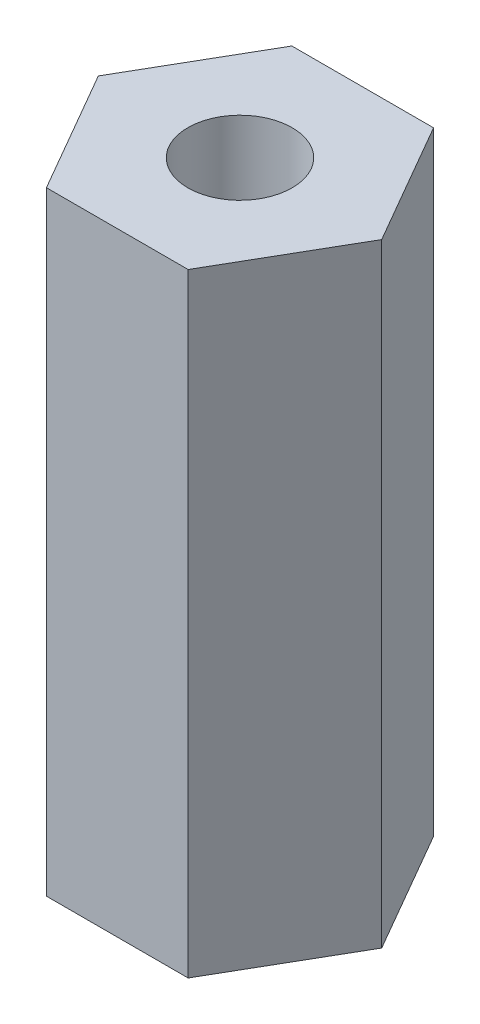
ISO-10303-21;
HEADER;
FILE_DESCRIPTION(('STEP AP214'),'2;1');
FILE_NAME('part.step','',(''),(''),'','','');
FILE_SCHEMA(('AUTOMOTIVE_DESIGN { 1 0 10303 214 1 1 1 1 }'));
ENDSEC;
DATA;
#1=APPLICATION_CONTEXT('core data for automotive mechanical design processes');
#2=APPLICATION_PROTOCOL_DEFINITION('international standard','automotive_design',2000,#1);
#3=PRODUCT_CONTEXT('',#1,'mechanical');
#4=PRODUCT('Part','Part','',(#3));
#5=PRODUCT_RELATED_PRODUCT_CATEGORY('part','',(#4));
#6=PRODUCT_DEFINITION_FORMATION('','',#4);
#7=PRODUCT_DEFINITION_CONTEXT('part definition',#1,'design');
#8=PRODUCT_DEFINITION('design','',#6,#7);
#9=PRODUCT_DEFINITION_SHAPE('','',#8);
#10=(LENGTH_UNIT() NAMED_UNIT(*) SI_UNIT(.MILLI.,.METRE.));
#11=(NAMED_UNIT(*) PLANE_ANGLE_UNIT() SI_UNIT($,.RADIAN.));
#12=(NAMED_UNIT(*) SI_UNIT($,.STERADIAN.) SOLID_ANGLE_UNIT());
#13=UNCERTAINTY_MEASURE_WITH_UNIT(LENGTH_MEASURE(1.E-05),#10,'distance_accuracy_value','');
#14=(GEOMETRIC_REPRESENTATION_CONTEXT(3) GLOBAL_UNCERTAINTY_ASSIGNED_CONTEXT((#13)) GLOBAL_UNIT_ASSIGNED_CONTEXT((#10,
#11,#12)) REPRESENTATION_CONTEXT('',''));
#15=CARTESIAN_POINT('',(0.,0.,0.));
#16=DIRECTION('',(0.,0.,1.));
#17=DIRECTION('',(1.,0.,0.));
#18=AXIS2_PLACEMENT_3D('',#15,#16,#17);
#19=CARTESIAN_POINT('',(0.,10.,4.));
#20=DIRECTION('',(0.,0.,-1.));
#21=DIRECTION('',(-1.,0.,0.));
#22=AXIS2_PLACEMENT_3D('',#19,#20,#21);
#23=PLANE('',#22);
#24=DIRECTION('',(1.,0.,0.));
#25=VECTOR('',#24,1.);
#26=CARTESIAN_POINT('',(0.,-10.,4.));
#27=LINE('',#26,#25);
#28=CARTESIAN_POINT('',(-2.30940107675851,-10.,4.));
#29=VERTEX_POINT('',#28);
#30=CARTESIAN_POINT('',(2.3094010767585,-10.,4.));
#31=VERTEX_POINT('',#30);
#32=EDGE_CURVE('E124',#29,#31,#27,.T.);
#33=ORIENTED_EDGE('',*,*,#32,.T.);
#34=DIRECTION('',(0.,-1.,0.));
#35=VECTOR('',#34,1.);
#36=CARTESIAN_POINT('',(2.3094010767585,10.,4.));
#37=LINE('',#36,#35);
#38=CARTESIAN_POINT('',(2.3094010767585,10.,4.));
#39=VERTEX_POINT('',#38);
#40=EDGE_CURVE('E11',#39,#31,#37,.T.);
#41=ORIENTED_EDGE('',*,*,#40,.F.);
#42=DIRECTION('',(1.,0.,0.));
#43=VECTOR('',#42,1.);
#44=CARTESIAN_POINT('',(0.,10.,4.));
#45=LINE('',#44,#43);
#46=CARTESIAN_POINT('',(-2.30940107675851,10.,4.));
#47=VERTEX_POINT('',#46);
#48=EDGE_CURVE('E147',#47,#39,#45,.T.);
#49=ORIENTED_EDGE('',*,*,#48,.F.);
#50=DIRECTION('',(0.,-1.,0.));
#51=VECTOR('',#50,1.);
#52=CARTESIAN_POINT('',(-2.30940107675851,10.,4.));
#53=LINE('',#52,#51);
#54=EDGE_CURVE('E117',#47,#29,#53,.T.);
#55=ORIENTED_EDGE('',*,*,#54,.T.);
#56=EDGE_LOOP('',(#33,#41,#49,#55));
#57=FACE_BOUND('',#56,.T.);
#58=ADVANCED_FACE('F36',(#57),#23,.F.);
#59=CARTESIAN_POINT('',(3.46410161513775,10.,2.));
#60=DIRECTION('',(-0.866025403784439,0.,-0.5));
#61=DIRECTION('',(-0.5,0.,0.866025403784439));
#62=AXIS2_PLACEMENT_3D('',#59,#60,#61);
#63=PLANE('',#62);
#64=DIRECTION('',(0.5,0.,-0.866025403784439));
#65=VECTOR('',#64,1.);
#66=CARTESIAN_POINT('',(3.46410161513775,-10.,2.));
#67=LINE('',#66,#65);
#68=CARTESIAN_POINT('',(4.61880215351701,-10.,0.));
#69=VERTEX_POINT('',#68);
#70=EDGE_CURVE('E127',#31,#69,#67,.T.);
#71=ORIENTED_EDGE('',*,*,#70,.T.);
#72=DIRECTION('',(0.,-1.,0.));
#73=VECTOR('',#72,1.);
#74=CARTESIAN_POINT('',(4.61880215351701,10.,0.));
#75=LINE('',#74,#73);
#76=CARTESIAN_POINT('',(4.61880215351701,10.,0.));
#77=VERTEX_POINT('',#76);
#78=EDGE_CURVE('E45',#77,#69,#75,.T.);
#79=ORIENTED_EDGE('',*,*,#78,.F.);
#80=DIRECTION('',(0.5,0.,-0.866025403784439));
#81=VECTOR('',#80,1.);
#82=CARTESIAN_POINT('',(3.46410161513775,10.,2.));
#83=LINE('',#82,#81);
#84=EDGE_CURVE('E90',#39,#77,#83,.T.);
#85=ORIENTED_EDGE('',*,*,#84,.F.);
#86=ORIENTED_EDGE('',*,*,#40,.T.);
#87=EDGE_LOOP('',(#71,#79,#85,#86));
#88=FACE_BOUND('',#87,.T.);
#89=ADVANCED_FACE('F161',(#88),#63,.F.);
#90=CARTESIAN_POINT('',(3.46410161513776,10.,-2.));
#91=DIRECTION('',(-0.866025403784439,0.,0.5));
#92=DIRECTION('',(0.5,0.,0.866025403784439));
#93=AXIS2_PLACEMENT_3D('',#90,#91,#92);
#94=PLANE('',#93);
#95=DIRECTION('',(-0.5,0.,-0.866025403784439));
#96=VECTOR('',#95,1.);
#97=CARTESIAN_POINT('',(3.46410161513776,-10.,-2.));
#98=LINE('',#97,#96);
#99=CARTESIAN_POINT('',(2.3094010767585,-10.,-4.));
#100=VERTEX_POINT('',#99);
#101=EDGE_CURVE('E129',#69,#100,#98,.T.);
#102=ORIENTED_EDGE('',*,*,#101,.T.);
#103=DIRECTION('',(0.,-1.,0.));
#104=VECTOR('',#103,1.);
#105=CARTESIAN_POINT('',(2.3094010767585,10.,-4.));
#106=LINE('',#105,#104);
#107=CARTESIAN_POINT('',(2.3094010767585,10.,-4.));
#108=VERTEX_POINT('',#107);
#109=EDGE_CURVE('E112',#108,#100,#106,.T.);
#110=ORIENTED_EDGE('',*,*,#109,.F.);
#111=DIRECTION('',(-0.5,0.,-0.866025403784439));
#112=VECTOR('',#111,1.);
#113=CARTESIAN_POINT('',(3.46410161513776,10.,-2.));
#114=LINE('',#113,#112);
#115=EDGE_CURVE('E103',#77,#108,#114,.T.);
#116=ORIENTED_EDGE('',*,*,#115,.F.);
#117=ORIENTED_EDGE('',*,*,#78,.T.);
#118=EDGE_LOOP('',(#102,#110,#116,#117));
#119=FACE_BOUND('',#118,.T.);
#120=ADVANCED_FACE('F140',(#119),#94,.F.);
#121=CARTESIAN_POINT('',(0.,10.,-4.));
#122=DIRECTION('',(0.,0.,1.));
#123=DIRECTION('',(1.,0.,0.));
#124=AXIS2_PLACEMENT_3D('',#121,#122,#123);
#125=PLANE('',#124);
#126=DIRECTION('',(-1.,0.,0.));
#127=VECTOR('',#126,1.);
#128=CARTESIAN_POINT('',(0.,-10.,-4.));
#129=LINE('',#128,#127);
#130=CARTESIAN_POINT('',(-2.3094010767585,-10.,-4.));
#131=VERTEX_POINT('',#130);
#132=EDGE_CURVE('E111',#100,#131,#129,.T.);
#133=ORIENTED_EDGE('',*,*,#132,.T.);
#134=DIRECTION('',(0.,-1.,0.));
#135=VECTOR('',#134,1.);
#136=CARTESIAN_POINT('',(-2.3094010767585,10.,-4.));
#137=LINE('',#136,#135);
#138=CARTESIAN_POINT('',(-2.3094010767585,10.,-4.));
#139=VERTEX_POINT('',#138);
#140=EDGE_CURVE('E108',#139,#131,#137,.T.);
#141=ORIENTED_EDGE('',*,*,#140,.F.);
#142=DIRECTION('',(-1.,0.,0.));
#143=VECTOR('',#142,1.);
#144=CARTESIAN_POINT('',(0.,10.,-4.));
#145=LINE('',#144,#143);
#146=EDGE_CURVE('E97',#108,#139,#145,.T.);
#147=ORIENTED_EDGE('',*,*,#146,.F.);
#148=ORIENTED_EDGE('',*,*,#109,.T.);
#149=EDGE_LOOP('',(#133,#141,#147,#148));
#150=FACE_BOUND('',#149,.T.);
#151=ADVANCED_FACE('F109',(#150),#125,.F.);
#152=CARTESIAN_POINT('',(-3.46410161513776,10.,-2.));
#153=DIRECTION('',(0.866025403784439,0.,0.5));
#154=DIRECTION('',(0.5,0.,-0.866025403784439));
#155=AXIS2_PLACEMENT_3D('',#152,#153,#154);
#156=PLANE('',#155);
#157=DIRECTION('',(-0.5,0.,0.866025403784439));
#158=VECTOR('',#157,1.);
#159=CARTESIAN_POINT('',(-3.46410161513776,-10.,-2.));
#160=LINE('',#159,#158);
#161=CARTESIAN_POINT('',(-4.61880215351701,-10.,0.));
#162=VERTEX_POINT('',#161);
#163=EDGE_CURVE('E76',#131,#162,#160,.T.);
#164=ORIENTED_EDGE('',*,*,#163,.T.);
#165=DIRECTION('',(0.,-1.,0.));
#166=VECTOR('',#165,1.);
#167=CARTESIAN_POINT('',(-4.61880215351701,10.,0.));
#168=LINE('',#167,#166);
#169=CARTESIAN_POINT('',(-4.61880215351701,10.,0.));
#170=VERTEX_POINT('',#169);
#171=EDGE_CURVE('E113',#170,#162,#168,.T.);
#172=ORIENTED_EDGE('',*,*,#171,.F.);
#173=DIRECTION('',(-0.5,0.,0.866025403784439));
#174=VECTOR('',#173,1.);
#175=CARTESIAN_POINT('',(-3.46410161513776,10.,-2.));
#176=LINE('',#175,#174);
#177=EDGE_CURVE('E101',#139,#170,#176,.T.);
#178=ORIENTED_EDGE('',*,*,#177,.F.);
#179=ORIENTED_EDGE('',*,*,#140,.T.);
#180=EDGE_LOOP('',(#164,#172,#178,#179));
#181=FACE_BOUND('',#180,.T.);
#182=ADVANCED_FACE('F115',(#181),#156,.F.);
#183=CARTESIAN_POINT('',(0.,10.,0.));
#184=DIRECTION('',(0.,-1.,0.));
#185=DIRECTION('',(0.,0.,-1.));
#186=AXIS2_PLACEMENT_3D('',#183,#184,#185);
#187=CYLINDRICAL_SURFACE('',#186,1.7);
#188=CARTESIAN_POINT('',(0.,10.,0.));
#189=DIRECTION('',(0.,1.,0.));
#190=DIRECTION('',(0.,0.,1.));
#191=AXIS2_PLACEMENT_3D('',#188,#189,#190);
#192=CIRCLE('',#191,1.7);
#193=CARTESIAN_POINT('',(0.,10.,1.7));
#194=VERTEX_POINT('',#193);
#195=EDGE_CURVE('E134',#194,#194,#192,.T.);
#196=ORIENTED_EDGE('',*,*,#195,.T.);
#197=EDGE_LOOP('',(#196));
#198=FACE_BOUND('',#197,.T.);
#199=CARTESIAN_POINT('',(0.,-10.,0.));
#200=DIRECTION('',(0.,1.,0.));
#201=DIRECTION('',(0.,0.,1.));
#202=AXIS2_PLACEMENT_3D('',#199,#200,#201);
#203=CIRCLE('',#202,1.7);
#204=CARTESIAN_POINT('',(0.,-10.,1.7));
#205=VERTEX_POINT('',#204);
#206=EDGE_CURVE('E121',#205,#205,#203,.T.);
#207=ORIENTED_EDGE('',*,*,#206,.F.);
#208=EDGE_LOOP('',(#207));
#209=FACE_BOUND('',#208,.T.);
#210=ADVANCED_FACE('F38',(#198,#209),#187,.F.);
#211=CARTESIAN_POINT('',(-3.46410161513776,10.,2.));
#212=DIRECTION('',(0.866025403784439,0.,-0.5));
#213=DIRECTION('',(-0.5,0.,-0.866025403784439));
#214=AXIS2_PLACEMENT_3D('',#211,#212,#213);
#215=PLANE('',#214);
#216=DIRECTION('',(0.5,0.,0.866025403784439));
#217=VECTOR('',#216,1.);
#218=CARTESIAN_POINT('',(-3.46410161513776,-10.,2.));
#219=LINE('',#218,#217);
#220=EDGE_CURVE('E82',#162,#29,#219,.T.);
#221=ORIENTED_EDGE('',*,*,#220,.T.);
#222=ORIENTED_EDGE('',*,*,#54,.F.);
#223=DIRECTION('',(0.5,0.,0.866025403784439));
#224=VECTOR('',#223,1.);
#225=CARTESIAN_POINT('',(-3.46410161513776,10.,2.));
#226=LINE('',#225,#224);
#227=EDGE_CURVE('E53',#170,#47,#226,.T.);
#228=ORIENTED_EDGE('',*,*,#227,.F.);
#229=ORIENTED_EDGE('',*,*,#171,.T.);
#230=EDGE_LOOP('',(#221,#222,#228,#229));
#231=FACE_BOUND('',#230,.T.);
#232=ADVANCED_FACE('F148',(#231),#215,.F.);
#233=CARTESIAN_POINT('',(0.,10.,0.));
#234=DIRECTION('',(0.,1.,0.));
#235=DIRECTION('',(0.,0.,1.));
#236=AXIS2_PLACEMENT_3D('',#233,#234,#235);
#237=PLANE('',#236);
#238=ORIENTED_EDGE('',*,*,#195,.F.);
#239=EDGE_LOOP('',(#238));
#240=FACE_BOUND('',#239,.T.);
#241=ORIENTED_EDGE('',*,*,#48,.T.);
#242=ORIENTED_EDGE('',*,*,#84,.T.);
#243=ORIENTED_EDGE('',*,*,#115,.T.);
#244=ORIENTED_EDGE('',*,*,#146,.T.);
#245=ORIENTED_EDGE('',*,*,#177,.T.);
#246=ORIENTED_EDGE('',*,*,#227,.T.);
#247=EDGE_LOOP('',(#241,#242,#243,#244,#245,#246));
#248=FACE_BOUND('',#247,.T.);
#249=ADVANCED_FACE('F99',(#240,#248),#237,.T.);
#250=CARTESIAN_POINT('',(0.,-10.,0.));
#251=DIRECTION('',(0.,1.,0.));
#252=DIRECTION('',(0.,0.,1.));
#253=AXIS2_PLACEMENT_3D('',#250,#251,#252);
#254=PLANE('',#253);
#255=ORIENTED_EDGE('',*,*,#206,.T.);
#256=EDGE_LOOP('',(#255));
#257=FACE_BOUND('',#256,.T.);
#258=ORIENTED_EDGE('',*,*,#32,.F.);
#259=ORIENTED_EDGE('',*,*,#220,.F.);
#260=ORIENTED_EDGE('',*,*,#163,.F.);
#261=ORIENTED_EDGE('',*,*,#132,.F.);
#262=ORIENTED_EDGE('',*,*,#101,.F.);
#263=ORIENTED_EDGE('',*,*,#70,.F.);
#264=EDGE_LOOP('',(#258,#259,#260,#261,#262,#263));
#265=FACE_BOUND('',#264,.T.);
#266=ADVANCED_FACE('F143',(#257,#265),#254,.F.);
#267=CLOSED_SHELL('',(#58,#89,#120,#151,#182,#210,#232,#249,#266));
#268=MANIFOLD_SOLID_BREP('B2',#267);
#269=ADVANCED_BREP_SHAPE_REPRESENTATION('',(#18,#268),#14);
#270=SHAPE_DEFINITION_REPRESENTATION(#9,#269);
ENDSEC;
END-ISO-10303-21;
